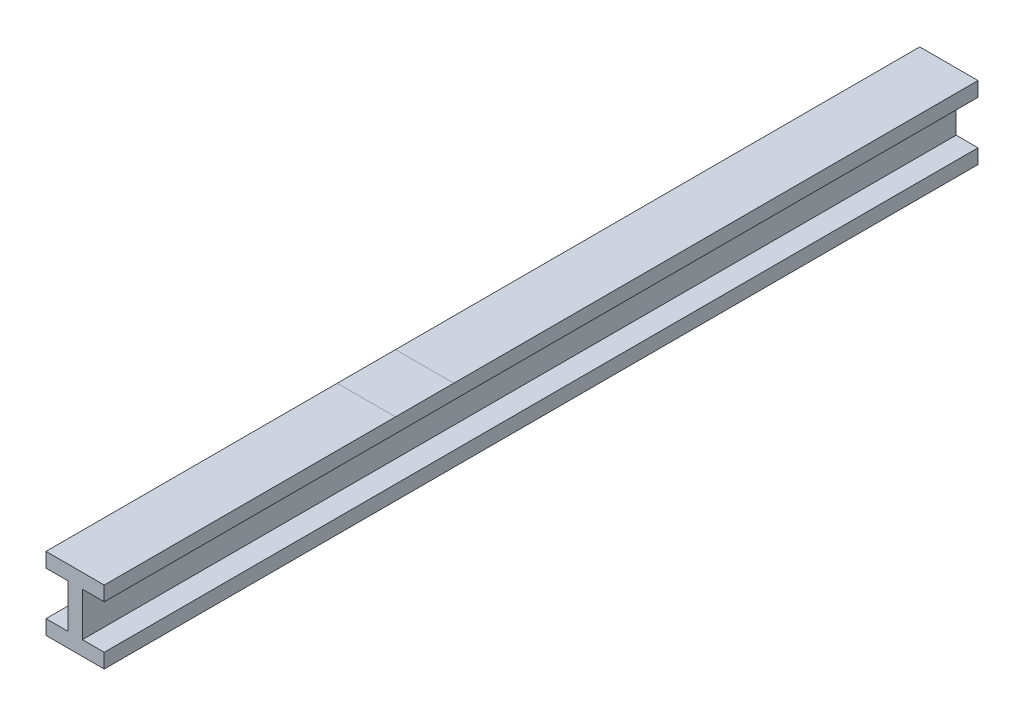
ISO-10303-21;
HEADER;
FILE_DESCRIPTION(('STEP AP214'),'2;1');
FILE_NAME('part.step','',(''),(''),'','','');
FILE_SCHEMA(('AUTOMOTIVE_DESIGN { 1 0 10303 214 1 1 1 1 }'));
ENDSEC;
DATA;
#1=APPLICATION_CONTEXT('core data for automotive mechanical design processes');
#2=APPLICATION_PROTOCOL_DEFINITION('international standard','automotive_design',2000,#1);
#3=PRODUCT_CONTEXT('',#1,'mechanical');
#4=PRODUCT('Part','Part','',(#3));
#5=PRODUCT_RELATED_PRODUCT_CATEGORY('part','',(#4));
#6=PRODUCT_DEFINITION_FORMATION('','',#4);
#7=PRODUCT_DEFINITION_CONTEXT('part definition',#1,'design');
#8=PRODUCT_DEFINITION('design','',#6,#7);
#9=PRODUCT_DEFINITION_SHAPE('','',#8);
#10=(LENGTH_UNIT() NAMED_UNIT(*) SI_UNIT(.MILLI.,.METRE.));
#11=(NAMED_UNIT(*) PLANE_ANGLE_UNIT() SI_UNIT($,.RADIAN.));
#12=(NAMED_UNIT(*) SI_UNIT($,.STERADIAN.) SOLID_ANGLE_UNIT());
#13=UNCERTAINTY_MEASURE_WITH_UNIT(LENGTH_MEASURE(1.E-05),#10,'distance_accuracy_value','');
#14=(GEOMETRIC_REPRESENTATION_CONTEXT(3) GLOBAL_UNCERTAINTY_ASSIGNED_CONTEXT((#13)) GLOBAL_UNIT_ASSIGNED_CONTEXT((#10,
#11,#12)) REPRESENTATION_CONTEXT('',''));
#15=CARTESIAN_POINT('',(0.,0.,0.));
#16=DIRECTION('',(0.,0.,1.));
#17=DIRECTION('',(1.,0.,0.));
#18=AXIS2_PLACEMENT_3D('',#15,#16,#17);
#19=CARTESIAN_POINT('',(200.,250.,-3000.));
#20=DIRECTION('',(0.,1.,0.));
#21=DIRECTION('',(-1.,0.,0.));
#22=AXIS2_PLACEMENT_3D('',#19,#20,#21);
#23=PLANE('',#22);
#24=DIRECTION('',(0.,0.,1.));
#25=VECTOR('',#24,1.);
#26=CARTESIAN_POINT('',(0.,250.,-3000.));
#27=LINE('',#26,#25);
#28=CARTESIAN_POINT('',(0.,250.,-3000.));
#29=VERTEX_POINT('',#28);
#30=CARTESIAN_POINT('',(0.,250.,-1200.));
#31=VERTEX_POINT('',#30);
#32=EDGE_CURVE('E240',#29,#31,#27,.T.);
#33=ORIENTED_EDGE('',*,*,#32,.T.);
#34=DIRECTION('',(1.,0.,0.));
#35=VECTOR('',#34,1.);
#36=CARTESIAN_POINT('',(200.,250.,-1200.));
#37=LINE('',#36,#35);
#38=CARTESIAN_POINT('',(200.,250.,-1200.));
#39=VERTEX_POINT('',#38);
#40=EDGE_CURVE('E11',#31,#39,#37,.T.);
#41=ORIENTED_EDGE('',*,*,#40,.T.);
#42=DIRECTION('',(0.,0.,1.));
#43=VECTOR('',#42,1.);
#44=CARTESIAN_POINT('',(200.,250.,-3000.));
#45=LINE('',#44,#43);
#46=CARTESIAN_POINT('',(200.,250.,-3000.));
#47=VERTEX_POINT('',#46);
#48=EDGE_CURVE('E245',#47,#39,#45,.T.);
#49=ORIENTED_EDGE('',*,*,#48,.F.);
#50=DIRECTION('',(-1.,0.,0.));
#51=VECTOR('',#50,1.);
#52=CARTESIAN_POINT('',(200.,250.,-3000.));
#53=LINE('',#52,#51);
#54=EDGE_CURVE('E191',#47,#29,#53,.T.);
#55=ORIENTED_EDGE('',*,*,#54,.T.);
#56=EDGE_LOOP('',(#33,#41,#49,#55));
#57=FACE_BOUND('',#56,.T.);
#58=ADVANCED_FACE('F47',(#57),#23,.T.);
#59=CARTESIAN_POINT('',(200.,250.,-1000.));
#60=VERTEX_POINT('',#59);
#61=CARTESIAN_POINT('',(200.,250.,0.));
#62=VERTEX_POINT('',#61);
#63=EDGE_CURVE('E249',#60,#62,#45,.T.);
#64=ORIENTED_EDGE('',*,*,#63,.F.);
#65=DIRECTION('',(-1.,0.,0.));
#66=VECTOR('',#65,1.);
#67=CARTESIAN_POINT('',(200.,250.,-1000.));
#68=LINE('',#67,#66);
#69=CARTESIAN_POINT('',(0.,250.,-1000.));
#70=VERTEX_POINT('',#69);
#71=EDGE_CURVE('E56',#60,#70,#68,.T.);
#72=ORIENTED_EDGE('',*,*,#71,.T.);
#73=CARTESIAN_POINT('',(0.,250.,0.));
#74=VERTEX_POINT('',#73);
#75=EDGE_CURVE('E244',#70,#74,#27,.T.);
#76=ORIENTED_EDGE('',*,*,#75,.T.);
#77=DIRECTION('',(-1.,0.,0.));
#78=VECTOR('',#77,1.);
#79=CARTESIAN_POINT('',(200.,250.,0.));
#80=LINE('',#79,#78);
#81=EDGE_CURVE('E222',#62,#74,#80,.T.);
#82=ORIENTED_EDGE('',*,*,#81,.F.);
#83=EDGE_LOOP('',(#64,#72,#76,#82));
#84=FACE_BOUND('',#83,.T.);
#85=ADVANCED_FACE('F301',(#84),#23,.T.);
#86=CARTESIAN_POINT('',(0.,50.,-3000.));
#87=DIRECTION('',(-1.,0.,0.));
#88=DIRECTION('',(0.,-1.,0.));
#89=AXIS2_PLACEMENT_3D('',#86,#87,#88);
#90=PLANE('',#89);
#91=DIRECTION('',(0.,-1.,0.));
#92=VECTOR('',#91,1.);
#93=CARTESIAN_POINT('',(0.,50.,0.));
#94=LINE('',#93,#92);
#95=CARTESIAN_POINT('',(0.,50.,0.));
#96=VERTEX_POINT('',#95);
#97=CARTESIAN_POINT('',(0.,0.,0.));
#98=VERTEX_POINT('',#97);
#99=EDGE_CURVE('E204',#96,#98,#94,.T.);
#100=ORIENTED_EDGE('',*,*,#99,.F.);
#101=DIRECTION('',(0.,0.,1.));
#102=VECTOR('',#101,1.);
#103=CARTESIAN_POINT('',(0.,50.,-3000.));
#104=LINE('',#103,#102);
#105=CARTESIAN_POINT('',(0.,50.,-3000.));
#106=VERTEX_POINT('',#105);
#107=EDGE_CURVE('E171',#106,#96,#104,.T.);
#108=ORIENTED_EDGE('',*,*,#107,.F.);
#109=DIRECTION('',(0.,-1.,0.));
#110=VECTOR('',#109,1.);
#111=CARTESIAN_POINT('',(0.,50.,-3000.));
#112=LINE('',#111,#110);
#113=CARTESIAN_POINT('',(0.,0.,-3000.));
#114=VERTEX_POINT('',#113);
#115=EDGE_CURVE('E165',#106,#114,#112,.T.);
#116=ORIENTED_EDGE('',*,*,#115,.T.);
#117=DIRECTION('',(0.,0.,1.));
#118=VECTOR('',#117,1.);
#119=CARTESIAN_POINT('',(0.,0.,-3000.));
#120=LINE('',#119,#118);
#121=EDGE_CURVE('E147',#114,#98,#120,.T.);
#122=ORIENTED_EDGE('',*,*,#121,.T.);
#123=EDGE_LOOP('',(#100,#108,#116,#122));
#124=FACE_BOUND('',#123,.T.);
#125=ADVANCED_FACE('F49',(#124),#90,.T.);
#126=CARTESIAN_POINT('',(75.,50.,-3000.));
#127=DIRECTION('',(0.,1.,0.));
#128=DIRECTION('',(-1.,0.,0.));
#129=AXIS2_PLACEMENT_3D('',#126,#127,#128);
#130=PLANE('',#129);
#131=DIRECTION('',(-1.,0.,0.));
#132=VECTOR('',#131,1.);
#133=CARTESIAN_POINT('',(75.,50.,0.));
#134=LINE('',#133,#132);
#135=CARTESIAN_POINT('',(75.,50.,0.));
#136=VERTEX_POINT('',#135);
#137=EDGE_CURVE('E172',#136,#96,#134,.T.);
#138=ORIENTED_EDGE('',*,*,#137,.F.);
#139=DIRECTION('',(0.,0.,1.));
#140=VECTOR('',#139,1.);
#141=CARTESIAN_POINT('',(75.,50.,-3000.));
#142=LINE('',#141,#140);
#143=CARTESIAN_POINT('',(75.,50.,-3000.));
#144=VERTEX_POINT('',#143);
#145=EDGE_CURVE('E234',#144,#136,#142,.T.);
#146=ORIENTED_EDGE('',*,*,#145,.F.);
#147=DIRECTION('',(-1.,0.,0.));
#148=VECTOR('',#147,1.);
#149=CARTESIAN_POINT('',(75.,50.,-3000.));
#150=LINE('',#149,#148);
#151=EDGE_CURVE('E158',#144,#106,#150,.T.);
#152=ORIENTED_EDGE('',*,*,#151,.T.);
#153=ORIENTED_EDGE('',*,*,#107,.T.);
#154=EDGE_LOOP('',(#138,#146,#152,#153));
#155=FACE_BOUND('',#154,.T.);
#156=ADVANCED_FACE('F272',(#155),#130,.T.);
#157=CARTESIAN_POINT('',(75.,200.,-3000.));
#158=DIRECTION('',(-1.,0.,0.));
#159=DIRECTION('',(0.,0.,1.));
#160=AXIS2_PLACEMENT_3D('',#157,#158,#159);
#161=PLANE('',#160);
#162=DIRECTION('',(0.,-1.,0.));
#163=VECTOR('',#162,1.);
#164=CARTESIAN_POINT('',(75.,200.,0.));
#165=LINE('',#164,#163);
#166=CARTESIAN_POINT('',(75.,200.,0.));
#167=VERTEX_POINT('',#166);
#168=EDGE_CURVE('E175',#167,#136,#165,.T.);
#169=ORIENTED_EDGE('',*,*,#168,.F.);
#170=DIRECTION('',(0.,0.,1.));
#171=VECTOR('',#170,1.);
#172=CARTESIAN_POINT('',(75.,200.,-3000.));
#173=LINE('',#172,#171);
#174=CARTESIAN_POINT('',(75.,200.,-3000.));
#175=VERTEX_POINT('',#174);
#176=EDGE_CURVE('E236',#175,#167,#173,.T.);
#177=ORIENTED_EDGE('',*,*,#176,.F.);
#178=DIRECTION('',(0.,-1.,0.));
#179=VECTOR('',#178,1.);
#180=CARTESIAN_POINT('',(75.,200.,-3000.));
#181=LINE('',#180,#179);
#182=EDGE_CURVE('E200',#175,#144,#181,.T.);
#183=ORIENTED_EDGE('',*,*,#182,.T.);
#184=ORIENTED_EDGE('',*,*,#145,.T.);
#185=EDGE_LOOP('',(#169,#177,#183,#184));
#186=FACE_BOUND('',#185,.T.);
#187=ADVANCED_FACE('F319',(#186),#161,.T.);
#188=CARTESIAN_POINT('',(0.,200.,-3000.));
#189=DIRECTION('',(0.,-1.,0.));
#190=DIRECTION('',(0.,0.,-1.));
#191=AXIS2_PLACEMENT_3D('',#188,#189,#190);
#192=PLANE('',#191);
#193=DIRECTION('',(1.,0.,0.));
#194=VECTOR('',#193,1.);
#195=CARTESIAN_POINT('',(0.,200.,0.));
#196=LINE('',#195,#194);
#197=CARTESIAN_POINT('',(0.,200.,0.));
#198=VERTEX_POINT('',#197);
#199=EDGE_CURVE('E228',#198,#167,#196,.T.);
#200=ORIENTED_EDGE('',*,*,#199,.F.);
#201=DIRECTION('',(0.,0.,1.));
#202=VECTOR('',#201,1.);
#203=CARTESIAN_POINT('',(0.,200.,-3000.));
#204=LINE('',#203,#202);
#205=CARTESIAN_POINT('',(0.,200.,-3000.));
#206=VERTEX_POINT('',#205);
#207=EDGE_CURVE('E238',#206,#198,#204,.T.);
#208=ORIENTED_EDGE('',*,*,#207,.F.);
#209=DIRECTION('',(1.,0.,0.));
#210=VECTOR('',#209,1.);
#211=CARTESIAN_POINT('',(0.,200.,-3000.));
#212=LINE('',#211,#210);
#213=EDGE_CURVE('E197',#206,#175,#212,.T.);
#214=ORIENTED_EDGE('',*,*,#213,.T.);
#215=ORIENTED_EDGE('',*,*,#176,.T.);
#216=EDGE_LOOP('',(#200,#208,#214,#215));
#217=FACE_BOUND('',#216,.T.);
#218=ADVANCED_FACE('F279',(#217),#192,.T.);
#219=CARTESIAN_POINT('',(0.,250.,-3000.));
#220=DIRECTION('',(-1.,0.,0.));
#221=DIRECTION('',(0.,-1.,0.));
#222=AXIS2_PLACEMENT_3D('',#219,#220,#221);
#223=PLANE('',#222);
#224=DIRECTION('',(0.,-1.,0.));
#225=VECTOR('',#224,1.);
#226=CARTESIAN_POINT('',(0.,250.,0.));
#227=LINE('',#226,#225);
#228=EDGE_CURVE('E225',#74,#198,#227,.T.);
#229=ORIENTED_EDGE('',*,*,#228,.F.);
#230=ORIENTED_EDGE('',*,*,#75,.F.);
#231=EDGE_CURVE('E243',#31,#70,#27,.T.);
#232=ORIENTED_EDGE('',*,*,#231,.F.);
#233=ORIENTED_EDGE('',*,*,#32,.F.);
#234=DIRECTION('',(0.,-1.,0.));
#235=VECTOR('',#234,1.);
#236=CARTESIAN_POINT('',(0.,250.,-3000.));
#237=LINE('',#236,#235);
#238=EDGE_CURVE('E194',#29,#206,#237,.T.);
#239=ORIENTED_EDGE('',*,*,#238,.T.);
#240=ORIENTED_EDGE('',*,*,#207,.T.);
#241=EDGE_LOOP('',(#229,#230,#232,#233,#239,#240));
#242=FACE_BOUND('',#241,.T.);
#243=ADVANCED_FACE('F282',(#242),#223,.T.);
#244=ORIENTED_EDGE('',*,*,#40,.F.);
#245=ORIENTED_EDGE('',*,*,#231,.T.);
#246=ORIENTED_EDGE('',*,*,#71,.F.);
#247=EDGE_CURVE('E248',#39,#60,#45,.T.);
#248=ORIENTED_EDGE('',*,*,#247,.F.);
#249=EDGE_LOOP('',(#244,#245,#246,#248));
#250=FACE_BOUND('',#249,.T.);
#251=ADVANCED_FACE('F302',(#250),#23,.T.);
#252=CARTESIAN_POINT('',(200.,200.,-3000.));
#253=DIRECTION('',(1.,0.,0.));
#254=DIRECTION('',(0.,1.,0.));
#255=AXIS2_PLACEMENT_3D('',#252,#253,#254);
#256=PLANE('',#255);
#257=DIRECTION('',(0.,1.,0.));
#258=VECTOR('',#257,1.);
#259=CARTESIAN_POINT('',(200.,200.,0.));
#260=LINE('',#259,#258);
#261=CARTESIAN_POINT('',(200.,200.,0.));
#262=VERTEX_POINT('',#261);
#263=EDGE_CURVE('E219',#262,#62,#260,.T.);
#264=ORIENTED_EDGE('',*,*,#263,.F.);
#265=DIRECTION('',(0.,0.,1.));
#266=VECTOR('',#265,1.);
#267=CARTESIAN_POINT('',(200.,200.,-3000.));
#268=LINE('',#267,#266);
#269=CARTESIAN_POINT('',(200.,200.,-3000.));
#270=VERTEX_POINT('',#269);
#271=EDGE_CURVE('E250',#270,#262,#268,.T.);
#272=ORIENTED_EDGE('',*,*,#271,.F.);
#273=DIRECTION('',(0.,1.,0.));
#274=VECTOR('',#273,1.);
#275=CARTESIAN_POINT('',(200.,200.,-3000.));
#276=LINE('',#275,#274);
#277=EDGE_CURVE('E188',#270,#47,#276,.T.);
#278=ORIENTED_EDGE('',*,*,#277,.T.);
#279=ORIENTED_EDGE('',*,*,#48,.T.);
#280=ORIENTED_EDGE('',*,*,#247,.T.);
#281=ORIENTED_EDGE('',*,*,#63,.T.);
#282=EDGE_LOOP('',(#264,#272,#278,#279,#280,#281));
#283=FACE_BOUND('',#282,.T.);
#284=ADVANCED_FACE('F289',(#283),#256,.T.);
#285=CARTESIAN_POINT('',(125.,200.,-3000.));
#286=DIRECTION('',(0.,-1.,0.));
#287=DIRECTION('',(0.,0.,-1.));
#288=AXIS2_PLACEMENT_3D('',#285,#286,#287);
#289=PLANE('',#288);
#290=DIRECTION('',(1.,0.,0.));
#291=VECTOR('',#290,1.);
#292=CARTESIAN_POINT('',(125.,200.,0.));
#293=LINE('',#292,#291);
#294=CARTESIAN_POINT('',(125.,200.,0.));
#295=VERTEX_POINT('',#294);
#296=EDGE_CURVE('E216',#295,#262,#293,.T.);
#297=ORIENTED_EDGE('',*,*,#296,.F.);
#298=DIRECTION('',(0.,0.,1.));
#299=VECTOR('',#298,1.);
#300=CARTESIAN_POINT('',(125.,200.,-3000.));
#301=LINE('',#300,#299);
#302=CARTESIAN_POINT('',(125.,200.,-3000.));
#303=VERTEX_POINT('',#302);
#304=EDGE_CURVE('E252',#303,#295,#301,.T.);
#305=ORIENTED_EDGE('',*,*,#304,.F.);
#306=DIRECTION('',(1.,0.,0.));
#307=VECTOR('',#306,1.);
#308=CARTESIAN_POINT('',(125.,200.,-3000.));
#309=LINE('',#308,#307);
#310=EDGE_CURVE('E185',#303,#270,#309,.T.);
#311=ORIENTED_EDGE('',*,*,#310,.T.);
#312=ORIENTED_EDGE('',*,*,#271,.T.);
#313=EDGE_LOOP('',(#297,#305,#311,#312));
#314=FACE_BOUND('',#313,.T.);
#315=ADVANCED_FACE('F294',(#314),#289,.T.);
#316=CARTESIAN_POINT('',(125.,50.,-3000.));
#317=DIRECTION('',(1.,0.,0.));
#318=DIRECTION('',(0.,0.,-1.));
#319=AXIS2_PLACEMENT_3D('',#316,#317,#318);
#320=PLANE('',#319);
#321=DIRECTION('',(0.,1.,0.));
#322=VECTOR('',#321,1.);
#323=CARTESIAN_POINT('',(125.,50.,0.));
#324=LINE('',#323,#322);
#325=CARTESIAN_POINT('',(125.,50.,0.));
#326=VERTEX_POINT('',#325);
#327=EDGE_CURVE('E213',#326,#295,#324,.T.);
#328=ORIENTED_EDGE('',*,*,#327,.F.);
#329=DIRECTION('',(0.,0.,1.));
#330=VECTOR('',#329,1.);
#331=CARTESIAN_POINT('',(125.,50.,-3000.));
#332=LINE('',#331,#330);
#333=CARTESIAN_POINT('',(125.,50.,-3000.));
#334=VERTEX_POINT('',#333);
#335=EDGE_CURVE('E254',#334,#326,#332,.T.);
#336=ORIENTED_EDGE('',*,*,#335,.F.);
#337=DIRECTION('',(0.,1.,0.));
#338=VECTOR('',#337,1.);
#339=CARTESIAN_POINT('',(125.,50.,-3000.));
#340=LINE('',#339,#338);
#341=EDGE_CURVE('E182',#334,#303,#340,.T.);
#342=ORIENTED_EDGE('',*,*,#341,.T.);
#343=ORIENTED_EDGE('',*,*,#304,.T.);
#344=EDGE_LOOP('',(#328,#336,#342,#343));
#345=FACE_BOUND('',#344,.T.);
#346=ADVANCED_FACE('F297',(#345),#320,.T.);
#347=CARTESIAN_POINT('',(200.,50.,-3000.));
#348=DIRECTION('',(0.,1.,0.));
#349=DIRECTION('',(0.,0.,1.));
#350=AXIS2_PLACEMENT_3D('',#347,#348,#349);
#351=PLANE('',#350);
#352=DIRECTION('',(-1.,0.,0.));
#353=VECTOR('',#352,1.);
#354=CARTESIAN_POINT('',(200.,50.,0.));
#355=LINE('',#354,#353);
#356=CARTESIAN_POINT('',(200.,50.,0.));
#357=VERTEX_POINT('',#356);
#358=EDGE_CURVE('E210',#357,#326,#355,.T.);
#359=ORIENTED_EDGE('',*,*,#358,.F.);
#360=DIRECTION('',(0.,0.,1.));
#361=VECTOR('',#360,1.);
#362=CARTESIAN_POINT('',(200.,50.,-3000.));
#363=LINE('',#362,#361);
#364=CARTESIAN_POINT('',(200.,50.,-3000.));
#365=VERTEX_POINT('',#364);
#366=EDGE_CURVE('E256',#365,#357,#363,.T.);
#367=ORIENTED_EDGE('',*,*,#366,.F.);
#368=DIRECTION('',(-1.,0.,0.));
#369=VECTOR('',#368,1.);
#370=CARTESIAN_POINT('',(200.,50.,-3000.));
#371=LINE('',#370,#369);
#372=EDGE_CURVE('E179',#365,#334,#371,.T.);
#373=ORIENTED_EDGE('',*,*,#372,.T.);
#374=ORIENTED_EDGE('',*,*,#335,.T.);
#375=EDGE_LOOP('',(#359,#367,#373,#374));
#376=FACE_BOUND('',#375,.T.);
#377=ADVANCED_FACE('F299',(#376),#351,.T.);
#378=CARTESIAN_POINT('',(200.,0.,-3000.));
#379=DIRECTION('',(1.,0.,0.));
#380=DIRECTION('',(0.,1.,0.));
#381=AXIS2_PLACEMENT_3D('',#378,#379,#380);
#382=PLANE('',#381);
#383=DIRECTION('',(0.,1.,0.));
#384=VECTOR('',#383,1.);
#385=CARTESIAN_POINT('',(200.,0.,0.));
#386=LINE('',#385,#384);
#387=CARTESIAN_POINT('',(200.,0.,0.));
#388=VERTEX_POINT('',#387);
#389=EDGE_CURVE('E207',#388,#357,#386,.T.);
#390=ORIENTED_EDGE('',*,*,#389,.F.);
#391=DIRECTION('',(0.,0.,1.));
#392=VECTOR('',#391,1.);
#393=CARTESIAN_POINT('',(200.,0.,-3000.));
#394=LINE('',#393,#392);
#395=CARTESIAN_POINT('',(200.,0.,-3000.));
#396=VERTEX_POINT('',#395);
#397=EDGE_CURVE('E157',#396,#388,#394,.T.);
#398=ORIENTED_EDGE('',*,*,#397,.F.);
#399=DIRECTION('',(0.,1.,0.));
#400=VECTOR('',#399,1.);
#401=CARTESIAN_POINT('',(200.,0.,-3000.));
#402=LINE('',#401,#400);
#403=EDGE_CURVE('E169',#396,#365,#402,.T.);
#404=ORIENTED_EDGE('',*,*,#403,.T.);
#405=ORIENTED_EDGE('',*,*,#366,.T.);
#406=EDGE_LOOP('',(#390,#398,#404,#405));
#407=FACE_BOUND('',#406,.T.);
#408=ADVANCED_FACE('F265',(#407),#382,.T.);
#409=CARTESIAN_POINT('',(0.,0.,-3000.));
#410=DIRECTION('',(0.,-1.,0.));
#411=DIRECTION('',(0.,0.,-1.));
#412=AXIS2_PLACEMENT_3D('',#409,#410,#411);
#413=PLANE('',#412);
#414=DIRECTION('',(1.,0.,0.));
#415=VECTOR('',#414,1.);
#416=CARTESIAN_POINT('',(0.,0.,0.));
#417=LINE('',#416,#415);
#418=EDGE_CURVE('E152',#98,#388,#417,.T.);
#419=ORIENTED_EDGE('',*,*,#418,.F.);
#420=ORIENTED_EDGE('',*,*,#121,.F.);
#421=DIRECTION('',(1.,0.,0.));
#422=VECTOR('',#421,1.);
#423=CARTESIAN_POINT('',(0.,0.,-3000.));
#424=LINE('',#423,#422);
#425=EDGE_CURVE('E150',#114,#396,#424,.T.);
#426=ORIENTED_EDGE('',*,*,#425,.T.);
#427=ORIENTED_EDGE('',*,*,#397,.T.);
#428=EDGE_LOOP('',(#419,#420,#426,#427));
#429=FACE_BOUND('',#428,.T.);
#430=ADVANCED_FACE('F149',(#429),#413,.T.);
#431=CARTESIAN_POINT('',(0.,0.,-3000.));
#432=DIRECTION('',(0.,0.,1.));
#433=DIRECTION('',(1.,0.,0.));
#434=AXIS2_PLACEMENT_3D('',#431,#432,#433);
#435=PLANE('',#434);
#436=ORIENTED_EDGE('',*,*,#115,.F.);
#437=ORIENTED_EDGE('',*,*,#151,.F.);
#438=ORIENTED_EDGE('',*,*,#182,.F.);
#439=ORIENTED_EDGE('',*,*,#213,.F.);
#440=ORIENTED_EDGE('',*,*,#238,.F.);
#441=ORIENTED_EDGE('',*,*,#54,.F.);
#442=ORIENTED_EDGE('',*,*,#277,.F.);
#443=ORIENTED_EDGE('',*,*,#310,.F.);
#444=ORIENTED_EDGE('',*,*,#341,.F.);
#445=ORIENTED_EDGE('',*,*,#372,.F.);
#446=ORIENTED_EDGE('',*,*,#403,.F.);
#447=ORIENTED_EDGE('',*,*,#425,.F.);
#448=EDGE_LOOP('',(#436,#437,#438,#439,#440,#441,#442,#443,#444,#445,#446,#447));
#449=FACE_BOUND('',#448,.T.);
#450=ADVANCED_FACE('F163',(#449),#435,.F.);
#451=CARTESIAN_POINT('',(0.,0.,0.));
#452=DIRECTION('',(0.,0.,1.));
#453=DIRECTION('',(1.,0.,0.));
#454=AXIS2_PLACEMENT_3D('',#451,#452,#453);
#455=PLANE('',#454);
#456=ORIENTED_EDGE('',*,*,#99,.T.);
#457=ORIENTED_EDGE('',*,*,#418,.T.);
#458=ORIENTED_EDGE('',*,*,#389,.T.);
#459=ORIENTED_EDGE('',*,*,#358,.T.);
#460=ORIENTED_EDGE('',*,*,#327,.T.);
#461=ORIENTED_EDGE('',*,*,#296,.T.);
#462=ORIENTED_EDGE('',*,*,#263,.T.);
#463=ORIENTED_EDGE('',*,*,#81,.T.);
#464=ORIENTED_EDGE('',*,*,#228,.T.);
#465=ORIENTED_EDGE('',*,*,#199,.T.);
#466=ORIENTED_EDGE('',*,*,#168,.T.);
#467=ORIENTED_EDGE('',*,*,#137,.T.);
#468=EDGE_LOOP('',(#456,#457,#458,#459,#460,#461,#462,#463,#464,#465,#466,#467));
#469=FACE_BOUND('',#468,.T.);
#470=ADVANCED_FACE('F268',(#469),#455,.T.);
#471=CLOSED_SHELL('',(#58,#85,#125,#156,#187,#218,#243,#251,#284,#315,#346,#377,#408,#430,#450,#470));
#472=MANIFOLD_SOLID_BREP('B2',#471);
#473=ADVANCED_BREP_SHAPE_REPRESENTATION('',(#18,#472),#14);
#474=SHAPE_DEFINITION_REPRESENTATION(#9,#473);
ENDSEC;
END-ISO-10303-21;
